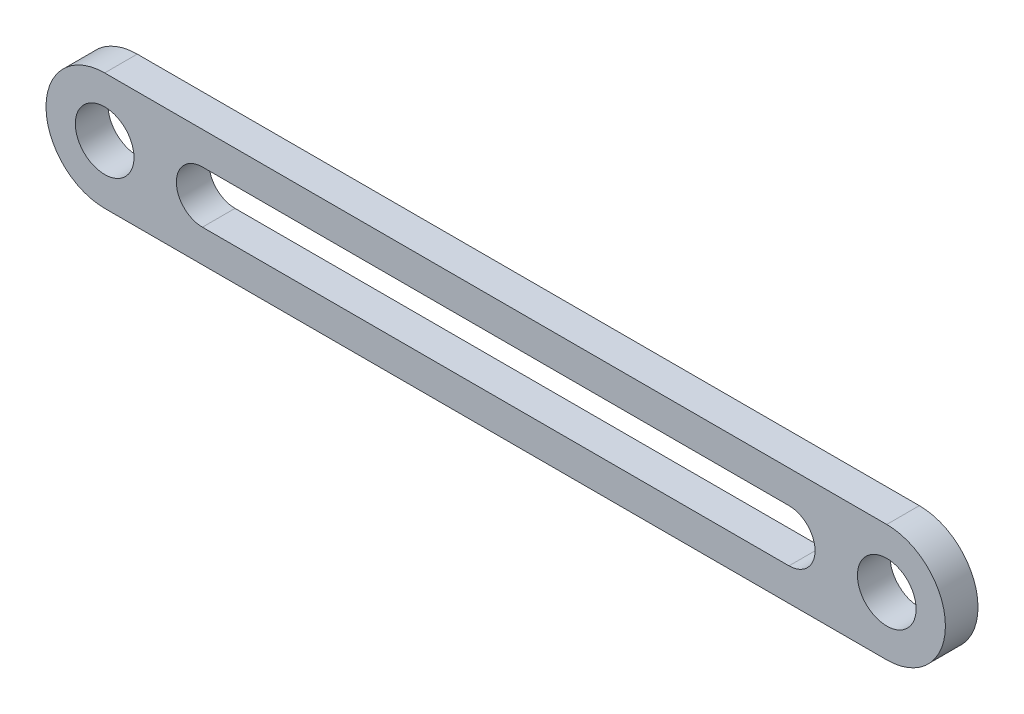
ISO-10303-21;
HEADER;
FILE_DESCRIPTION(('STEP AP214'),'2;1');
FILE_NAME('part.step','',(''),(''),'','','');
FILE_SCHEMA(('AUTOMOTIVE_DESIGN { 1 0 10303 214 1 1 1 1 }'));
ENDSEC;
DATA;
#1=APPLICATION_CONTEXT('core data for automotive mechanical design processes');
#2=APPLICATION_PROTOCOL_DEFINITION('international standard','automotive_design',2000,#1);
#3=PRODUCT_CONTEXT('',#1,'mechanical');
#4=PRODUCT('Part','Part','',(#3));
#5=PRODUCT_RELATED_PRODUCT_CATEGORY('part','',(#4));
#6=PRODUCT_DEFINITION_FORMATION('','',#4);
#7=PRODUCT_DEFINITION_CONTEXT('part definition',#1,'design');
#8=PRODUCT_DEFINITION('design','',#6,#7);
#9=PRODUCT_DEFINITION_SHAPE('','',#8);
#10=(LENGTH_UNIT() NAMED_UNIT(*) SI_UNIT(.MILLI.,.METRE.));
#11=(NAMED_UNIT(*) PLANE_ANGLE_UNIT() SI_UNIT($,.RADIAN.));
#12=(NAMED_UNIT(*) SI_UNIT($,.STERADIAN.) SOLID_ANGLE_UNIT());
#13=UNCERTAINTY_MEASURE_WITH_UNIT(LENGTH_MEASURE(1.E-05),#10,'distance_accuracy_value','');
#14=(GEOMETRIC_REPRESENTATION_CONTEXT(3) GLOBAL_UNCERTAINTY_ASSIGNED_CONTEXT((#13)) GLOBAL_UNIT_ASSIGNED_CONTEXT((#10,
#11,#12)) REPRESENTATION_CONTEXT('',''));
#15=CARTESIAN_POINT('',(0.,0.,0.));
#16=DIRECTION('',(0.,0.,1.));
#17=DIRECTION('',(1.,0.,0.));
#18=AXIS2_PLACEMENT_3D('',#15,#16,#17);
#19=CARTESIAN_POINT('',(-60.,0.,5.));
#20=DIRECTION('',(0.,0.,1.));
#21=DIRECTION('',(1.,0.,0.));
#22=AXIS2_PLACEMENT_3D('',#19,#20,#21);
#23=PLANE('',#22);
#24=CARTESIAN_POINT('',(-45.,0.,5.));
#25=DIRECTION('',(0.,0.,1.));
#26=DIRECTION('',(1.,0.,0.));
#27=AXIS2_PLACEMENT_3D('',#24,#25,#26);
#28=CIRCLE('',#27,4.);
#29=CARTESIAN_POINT('',(-45.,4.,5.));
#30=VERTEX_POINT('',#29);
#31=CARTESIAN_POINT('',(-45.,-4.,5.));
#32=VERTEX_POINT('',#31);
#33=EDGE_CURVE('E48',#30,#32,#28,.T.);
#34=ORIENTED_EDGE('',*,*,#33,.F.);
#35=DIRECTION('',(-1.,0.,0.));
#36=VECTOR('',#35,1.);
#37=CARTESIAN_POINT('',(-45.,4.,5.));
#38=LINE('',#37,#36);
#39=CARTESIAN_POINT('',(45.,4.00000000000002,5.));
#40=VERTEX_POINT('',#39);
#41=EDGE_CURVE('E116',#40,#30,#38,.T.);
#42=ORIENTED_EDGE('',*,*,#41,.F.);
#43=CARTESIAN_POINT('',(45.,0.,5.));
#44=DIRECTION('',(0.,0.,1.));
#45=DIRECTION('',(1.,0.,0.));
#46=AXIS2_PLACEMENT_3D('',#43,#44,#45);
#47=CIRCLE('',#46,4.);
#48=CARTESIAN_POINT('',(45.,-3.99999999999998,5.));
#49=VERTEX_POINT('',#48);
#50=EDGE_CURVE('E101',#49,#40,#47,.T.);
#51=ORIENTED_EDGE('',*,*,#50,.F.);
#52=DIRECTION('',(1.,0.,0.));
#53=VECTOR('',#52,1.);
#54=CARTESIAN_POINT('',(-45.,-4.,5.));
#55=LINE('',#54,#53);
#56=EDGE_CURVE('E110',#32,#49,#55,.T.);
#57=ORIENTED_EDGE('',*,*,#56,.F.);
#58=EDGE_LOOP('',(#34,#42,#51,#57));
#59=FACE_BOUND('',#58,.T.);
#60=CARTESIAN_POINT('',(-60.,0.,5.));
#61=DIRECTION('',(0.,0.,1.));
#62=DIRECTION('',(1.,0.,0.));
#63=AXIS2_PLACEMENT_3D('',#60,#61,#62);
#64=CIRCLE('',#63,4.5);
#65=CARTESIAN_POINT('',(-55.5,0.,5.));
#66=VERTEX_POINT('',#65);
#67=EDGE_CURVE('E132',#66,#66,#64,.T.);
#68=ORIENTED_EDGE('',*,*,#67,.F.);
#69=EDGE_LOOP('',(#68));
#70=FACE_BOUND('',#69,.T.);
#71=CARTESIAN_POINT('',(-60.,0.,5.));
#72=DIRECTION('',(0.,0.,1.));
#73=DIRECTION('',(1.,0.,0.));
#74=AXIS2_PLACEMENT_3D('',#71,#72,#73);
#75=CIRCLE('',#74,9.);
#76=CARTESIAN_POINT('',(-60.,9.,5.));
#77=VERTEX_POINT('',#76);
#78=CARTESIAN_POINT('',(-60.,-9.,5.));
#79=VERTEX_POINT('',#78);
#80=EDGE_CURVE('E138',#77,#79,#75,.T.);
#81=ORIENTED_EDGE('',*,*,#80,.T.);
#82=DIRECTION('',(1.,0.,0.));
#83=VECTOR('',#82,1.);
#84=CARTESIAN_POINT('',(-60.,-9.,5.));
#85=LINE('',#84,#83);
#86=CARTESIAN_POINT('',(60.,-8.99999999999998,5.));
#87=VERTEX_POINT('',#86);
#88=EDGE_CURVE('E141',#79,#87,#85,.T.);
#89=ORIENTED_EDGE('',*,*,#88,.T.);
#90=CARTESIAN_POINT('',(60.,0.,5.));
#91=DIRECTION('',(0.,0.,1.));
#92=DIRECTION('',(1.,0.,0.));
#93=AXIS2_PLACEMENT_3D('',#90,#91,#92);
#94=CIRCLE('',#93,9.);
#95=CARTESIAN_POINT('',(60.,9.00000000000002,5.));
#96=VERTEX_POINT('',#95);
#97=EDGE_CURVE('E144',#87,#96,#94,.T.);
#98=ORIENTED_EDGE('',*,*,#97,.T.);
#99=DIRECTION('',(-1.,0.,0.));
#100=VECTOR('',#99,1.);
#101=CARTESIAN_POINT('',(-60.,9.,5.));
#102=LINE('',#101,#100);
#103=EDGE_CURVE('E146',#96,#77,#102,.T.);
#104=ORIENTED_EDGE('',*,*,#103,.T.);
#105=EDGE_LOOP('',(#81,#89,#98,#104));
#106=FACE_BOUND('',#105,.T.);
#107=CARTESIAN_POINT('',(60.,0.,5.));
#108=DIRECTION('',(0.,0.,1.));
#109=DIRECTION('',(1.,0.,0.));
#110=AXIS2_PLACEMENT_3D('',#107,#108,#109);
#111=CIRCLE('',#110,4.5);
#112=CARTESIAN_POINT('',(64.5,0.,5.));
#113=VERTEX_POINT('',#112);
#114=EDGE_CURVE('E126',#113,#113,#111,.T.);
#115=ORIENTED_EDGE('',*,*,#114,.F.);
#116=EDGE_LOOP('',(#115));
#117=FACE_BOUND('',#116,.T.);
#118=ADVANCED_FACE('F33',(#59,#70,#106,#117),#23,.T.);
#119=CARTESIAN_POINT('',(-60.,0.,0.));
#120=DIRECTION('',(0.,0.,1.));
#121=DIRECTION('',(1.,0.,0.));
#122=AXIS2_PLACEMENT_3D('',#119,#120,#121);
#123=PLANE('',#122);
#124=DIRECTION('',(-1.,0.,0.));
#125=VECTOR('',#124,1.);
#126=CARTESIAN_POINT('',(-60.,4.,0.));
#127=LINE('',#126,#125);
#128=CARTESIAN_POINT('',(45.,4.00000000000002,0.));
#129=VERTEX_POINT('',#128);
#130=CARTESIAN_POINT('',(-45.,4.,0.));
#131=VERTEX_POINT('',#130);
#132=EDGE_CURVE('E41',#129,#131,#127,.T.);
#133=ORIENTED_EDGE('',*,*,#132,.T.);
#134=CARTESIAN_POINT('',(-45.,0.,0.));
#135=DIRECTION('',(0.,0.,1.));
#136=DIRECTION('',(1.,0.,0.));
#137=AXIS2_PLACEMENT_3D('',#134,#135,#136);
#138=CIRCLE('',#137,4.);
#139=CARTESIAN_POINT('',(-45.,-4.,0.));
#140=VERTEX_POINT('',#139);
#141=EDGE_CURVE('E11',#131,#140,#138,.T.);
#142=ORIENTED_EDGE('',*,*,#141,.T.);
#143=DIRECTION('',(1.,0.,0.));
#144=VECTOR('',#143,1.);
#145=CARTESIAN_POINT('',(-60.,-4.,0.));
#146=LINE('',#145,#144);
#147=CARTESIAN_POINT('',(45.,-3.99999999999998,0.));
#148=VERTEX_POINT('',#147);
#149=EDGE_CURVE('E167',#140,#148,#146,.T.);
#150=ORIENTED_EDGE('',*,*,#149,.T.);
#151=CARTESIAN_POINT('',(45.,0.,0.));
#152=DIRECTION('',(0.,0.,1.));
#153=DIRECTION('',(1.,0.,0.));
#154=AXIS2_PLACEMENT_3D('',#151,#152,#153);
#155=CIRCLE('',#154,4.);
#156=EDGE_CURVE('E104',#148,#129,#155,.T.);
#157=ORIENTED_EDGE('',*,*,#156,.T.);
#158=EDGE_LOOP('',(#133,#142,#150,#157));
#159=FACE_BOUND('',#158,.T.);
#160=CARTESIAN_POINT('',(-60.,0.,0.));
#161=DIRECTION('',(0.,0.,1.));
#162=DIRECTION('',(1.,0.,0.));
#163=AXIS2_PLACEMENT_3D('',#160,#161,#162);
#164=CIRCLE('',#163,9.);
#165=CARTESIAN_POINT('',(-60.,9.,0.));
#166=VERTEX_POINT('',#165);
#167=CARTESIAN_POINT('',(-60.,-9.,0.));
#168=VERTEX_POINT('',#167);
#169=EDGE_CURVE('E135',#166,#168,#164,.T.);
#170=ORIENTED_EDGE('',*,*,#169,.F.);
#171=DIRECTION('',(-1.,0.,0.));
#172=VECTOR('',#171,1.);
#173=CARTESIAN_POINT('',(-60.,9.,0.));
#174=LINE('',#173,#172);
#175=CARTESIAN_POINT('',(60.,9.00000000000002,0.));
#176=VERTEX_POINT('',#175);
#177=EDGE_CURVE('E142',#176,#166,#174,.T.);
#178=ORIENTED_EDGE('',*,*,#177,.F.);
#179=CARTESIAN_POINT('',(60.,0.,0.));
#180=DIRECTION('',(0.,0.,1.));
#181=DIRECTION('',(1.,0.,0.));
#182=AXIS2_PLACEMENT_3D('',#179,#180,#181);
#183=CIRCLE('',#182,9.);
#184=CARTESIAN_POINT('',(60.,-8.99999999999998,0.));
#185=VERTEX_POINT('',#184);
#186=EDGE_CURVE('E153',#185,#176,#183,.T.);
#187=ORIENTED_EDGE('',*,*,#186,.F.);
#188=DIRECTION('',(1.,0.,0.));
#189=VECTOR('',#188,1.);
#190=CARTESIAN_POINT('',(-60.,-9.,0.));
#191=LINE('',#190,#189);
#192=EDGE_CURVE('E151',#168,#185,#191,.T.);
#193=ORIENTED_EDGE('',*,*,#192,.F.);
#194=EDGE_LOOP('',(#170,#178,#187,#193));
#195=FACE_BOUND('',#194,.T.);
#196=CARTESIAN_POINT('',(-60.,0.,0.));
#197=DIRECTION('',(0.,0.,1.));
#198=DIRECTION('',(1.,0.,0.));
#199=AXIS2_PLACEMENT_3D('',#196,#197,#198);
#200=CIRCLE('',#199,4.5);
#201=CARTESIAN_POINT('',(-55.5,0.,0.));
#202=VERTEX_POINT('',#201);
#203=EDGE_CURVE('E129',#202,#202,#200,.T.);
#204=ORIENTED_EDGE('',*,*,#203,.T.);
#205=EDGE_LOOP('',(#204));
#206=FACE_BOUND('',#205,.T.);
#207=CARTESIAN_POINT('',(60.,0.,0.));
#208=DIRECTION('',(0.,0.,1.));
#209=DIRECTION('',(1.,0.,0.));
#210=AXIS2_PLACEMENT_3D('',#207,#208,#209);
#211=CIRCLE('',#210,4.5);
#212=CARTESIAN_POINT('',(64.5,0.,0.));
#213=VERTEX_POINT('',#212);
#214=EDGE_CURVE('E123',#213,#213,#211,.T.);
#215=ORIENTED_EDGE('',*,*,#214,.T.);
#216=EDGE_LOOP('',(#215));
#217=FACE_BOUND('',#216,.T.);
#218=ADVANCED_FACE('F171',(#159,#195,#206,#217),#123,.F.);
#219=CARTESIAN_POINT('',(-60.,0.,5.));
#220=DIRECTION('',(0.,0.,-1.));
#221=DIRECTION('',(-1.,0.,0.));
#222=AXIS2_PLACEMENT_3D('',#219,#220,#221);
#223=CYLINDRICAL_SURFACE('',#222,9.);
#224=ORIENTED_EDGE('',*,*,#169,.T.);
#225=DIRECTION('',(0.,0.,-1.));
#226=VECTOR('',#225,1.);
#227=CARTESIAN_POINT('',(-60.,-9.,5.));
#228=LINE('',#227,#226);
#229=EDGE_CURVE('E164',#79,#168,#228,.T.);
#230=ORIENTED_EDGE('',*,*,#229,.F.);
#231=ORIENTED_EDGE('',*,*,#80,.F.);
#232=DIRECTION('',(0.,0.,-1.));
#233=VECTOR('',#232,1.);
#234=CARTESIAN_POINT('',(-60.,9.,5.));
#235=LINE('',#234,#233);
#236=EDGE_CURVE('E148',#77,#166,#235,.T.);
#237=ORIENTED_EDGE('',*,*,#236,.T.);
#238=EDGE_LOOP('',(#224,#230,#231,#237));
#239=FACE_BOUND('',#238,.T.);
#240=ADVANCED_FACE('F35',(#239),#223,.T.);
#241=CARTESIAN_POINT('',(-60.,-9.,5.));
#242=DIRECTION('',(0.,1.,0.));
#243=DIRECTION('',(-1.,0.,0.));
#244=AXIS2_PLACEMENT_3D('',#241,#242,#243);
#245=PLANE('',#244);
#246=ORIENTED_EDGE('',*,*,#192,.T.);
#247=DIRECTION('',(0.,0.,-1.));
#248=VECTOR('',#247,1.);
#249=CARTESIAN_POINT('',(60.,-8.99999999999998,5.));
#250=LINE('',#249,#248);
#251=EDGE_CURVE('E161',#87,#185,#250,.T.);
#252=ORIENTED_EDGE('',*,*,#251,.F.);
#253=ORIENTED_EDGE('',*,*,#88,.F.);
#254=ORIENTED_EDGE('',*,*,#229,.T.);
#255=EDGE_LOOP('',(#246,#252,#253,#254));
#256=FACE_BOUND('',#255,.T.);
#257=ADVANCED_FACE('F203',(#256),#245,.F.);
#258=CARTESIAN_POINT('',(60.,0.,5.));
#259=DIRECTION('',(0.,0.,-1.));
#260=DIRECTION('',(-1.,0.,0.));
#261=AXIS2_PLACEMENT_3D('',#258,#259,#260);
#262=CYLINDRICAL_SURFACE('',#261,9.);
#263=ORIENTED_EDGE('',*,*,#186,.T.);
#264=DIRECTION('',(0.,0.,-1.));
#265=VECTOR('',#264,1.);
#266=CARTESIAN_POINT('',(60.,9.00000000000002,5.));
#267=LINE('',#266,#265);
#268=EDGE_CURVE('E158',#96,#176,#267,.T.);
#269=ORIENTED_EDGE('',*,*,#268,.F.);
#270=ORIENTED_EDGE('',*,*,#97,.F.);
#271=ORIENTED_EDGE('',*,*,#251,.T.);
#272=EDGE_LOOP('',(#263,#269,#270,#271));
#273=FACE_BOUND('',#272,.T.);
#274=ADVANCED_FACE('F200',(#273),#262,.T.);
#275=CARTESIAN_POINT('',(-60.,9.,5.));
#276=DIRECTION('',(0.,-1.,0.));
#277=DIRECTION('',(1.,0.,0.));
#278=AXIS2_PLACEMENT_3D('',#275,#276,#277);
#279=PLANE('',#278);
#280=ORIENTED_EDGE('',*,*,#177,.T.);
#281=ORIENTED_EDGE('',*,*,#236,.F.);
#282=ORIENTED_EDGE('',*,*,#103,.F.);
#283=ORIENTED_EDGE('',*,*,#268,.T.);
#284=EDGE_LOOP('',(#280,#281,#282,#283));
#285=FACE_BOUND('',#284,.T.);
#286=ADVANCED_FACE('F197',(#285),#279,.F.);
#287=CARTESIAN_POINT('',(-60.,0.,5.));
#288=DIRECTION('',(0.,0.,-1.));
#289=DIRECTION('',(-1.,0.,0.));
#290=AXIS2_PLACEMENT_3D('',#287,#288,#289);
#291=CYLINDRICAL_SURFACE('',#290,4.5);
#292=ORIENTED_EDGE('',*,*,#67,.T.);
#293=EDGE_LOOP('',(#292));
#294=FACE_BOUND('',#293,.T.);
#295=ORIENTED_EDGE('',*,*,#203,.F.);
#296=EDGE_LOOP('',(#295));
#297=FACE_BOUND('',#296,.T.);
#298=ADVANCED_FACE('F185',(#294,#297),#291,.F.);
#299=CARTESIAN_POINT('',(60.,0.,5.));
#300=DIRECTION('',(0.,0.,-1.));
#301=DIRECTION('',(-1.,0.,0.));
#302=AXIS2_PLACEMENT_3D('',#299,#300,#301);
#303=CYLINDRICAL_SURFACE('',#302,4.5);
#304=ORIENTED_EDGE('',*,*,#114,.T.);
#305=EDGE_LOOP('',(#304));
#306=FACE_BOUND('',#305,.T.);
#307=ORIENTED_EDGE('',*,*,#214,.F.);
#308=EDGE_LOOP('',(#307));
#309=FACE_BOUND('',#308,.T.);
#310=ADVANCED_FACE('F178',(#306,#309),#303,.F.);
#311=CARTESIAN_POINT('',(-45.,0.,-5.));
#312=DIRECTION('',(0.,0.,1.));
#313=DIRECTION('',(1.,0.,0.));
#314=AXIS2_PLACEMENT_3D('',#311,#312,#313);
#315=CYLINDRICAL_SURFACE('',#314,4.);
#316=DIRECTION('',(0.,0.,1.));
#317=VECTOR('',#316,1.);
#318=CARTESIAN_POINT('',(-45.,4.,-5.));
#319=LINE('',#318,#317);
#320=EDGE_CURVE('E121',#131,#30,#319,.T.);
#321=ORIENTED_EDGE('',*,*,#320,.T.);
#322=ORIENTED_EDGE('',*,*,#33,.T.);
#323=DIRECTION('',(0.,0.,1.));
#324=VECTOR('',#323,1.);
#325=CARTESIAN_POINT('',(-45.,-4.,-5.));
#326=LINE('',#325,#324);
#327=EDGE_CURVE('E107',#140,#32,#326,.T.);
#328=ORIENTED_EDGE('',*,*,#327,.F.);
#329=ORIENTED_EDGE('',*,*,#141,.F.);
#330=EDGE_LOOP('',(#321,#322,#328,#329));
#331=FACE_BOUND('',#330,.T.);
#332=ADVANCED_FACE('F176',(#331),#315,.F.);
#333=CARTESIAN_POINT('',(-45.,4.,-5.));
#334=DIRECTION('',(0.,1.,0.));
#335=DIRECTION('',(-1.,0.,0.));
#336=AXIS2_PLACEMENT_3D('',#333,#334,#335);
#337=PLANE('',#336);
#338=DIRECTION('',(0.,0.,1.));
#339=VECTOR('',#338,1.);
#340=CARTESIAN_POINT('',(45.,4.00000000000002,-5.));
#341=LINE('',#340,#339);
#342=EDGE_CURVE('E106',#129,#40,#341,.T.);
#343=ORIENTED_EDGE('',*,*,#342,.T.);
#344=ORIENTED_EDGE('',*,*,#41,.T.);
#345=ORIENTED_EDGE('',*,*,#320,.F.);
#346=ORIENTED_EDGE('',*,*,#132,.F.);
#347=EDGE_LOOP('',(#343,#344,#345,#346));
#348=FACE_BOUND('',#347,.T.);
#349=ADVANCED_FACE('F175',(#348),#337,.F.);
#350=CARTESIAN_POINT('',(45.,0.,-5.));
#351=DIRECTION('',(0.,0.,1.));
#352=DIRECTION('',(1.,0.,0.));
#353=AXIS2_PLACEMENT_3D('',#350,#351,#352);
#354=CYLINDRICAL_SURFACE('',#353,4.);
#355=DIRECTION('',(0.,0.,1.));
#356=VECTOR('',#355,1.);
#357=CARTESIAN_POINT('',(45.,-3.99999999999998,-5.));
#358=LINE('',#357,#356);
#359=EDGE_CURVE('E56',#148,#49,#358,.T.);
#360=ORIENTED_EDGE('',*,*,#359,.T.);
#361=ORIENTED_EDGE('',*,*,#50,.T.);
#362=ORIENTED_EDGE('',*,*,#342,.F.);
#363=ORIENTED_EDGE('',*,*,#156,.F.);
#364=EDGE_LOOP('',(#360,#361,#362,#363));
#365=FACE_BOUND('',#364,.T.);
#366=ADVANCED_FACE('F98',(#365),#354,.F.);
#367=CARTESIAN_POINT('',(-45.,-4.,-5.));
#368=DIRECTION('',(0.,-1.,0.));
#369=DIRECTION('',(1.,0.,0.));
#370=AXIS2_PLACEMENT_3D('',#367,#368,#369);
#371=PLANE('',#370);
#372=ORIENTED_EDGE('',*,*,#327,.T.);
#373=ORIENTED_EDGE('',*,*,#56,.T.);
#374=ORIENTED_EDGE('',*,*,#359,.F.);
#375=ORIENTED_EDGE('',*,*,#149,.F.);
#376=EDGE_LOOP('',(#372,#373,#374,#375));
#377=FACE_BOUND('',#376,.T.);
#378=ADVANCED_FACE('F111',(#377),#371,.F.);
#379=CLOSED_SHELL('',(#118,#218,#240,#257,#274,#286,#298,#310,#332,#349,#366,#378));
#380=MANIFOLD_SOLID_BREP('B2',#379);
#381=ADVANCED_BREP_SHAPE_REPRESENTATION('',(#18,#380),#14);
#382=SHAPE_DEFINITION_REPRESENTATION(#9,#381);
ENDSEC;
END-ISO-10303-21;
